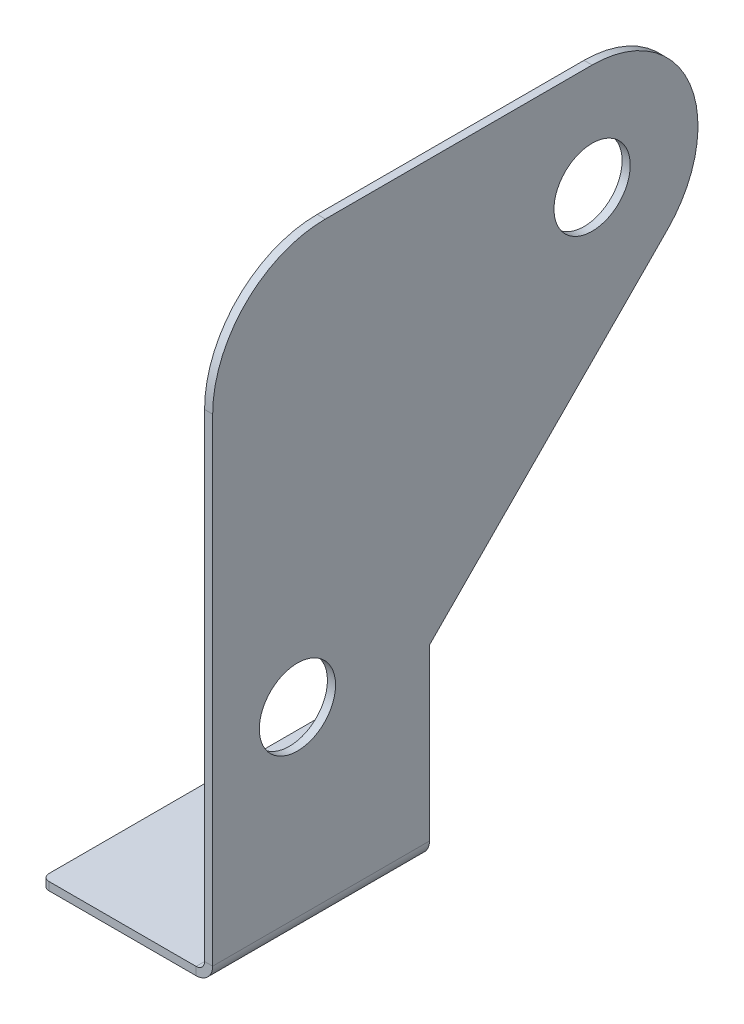
ISO-10303-21;
HEADER;
FILE_DESCRIPTION(('STEP AP214'),'2;1');
FILE_NAME('part.step','',(''),(''),'','','');
FILE_SCHEMA(('AUTOMOTIVE_DESIGN { 1 0 10303 214 1 1 1 1 }'));
ENDSEC;
DATA;
#1=APPLICATION_CONTEXT('core data for automotive mechanical design processes');
#2=APPLICATION_PROTOCOL_DEFINITION('international standard','automotive_design',2000,#1);
#3=PRODUCT_CONTEXT('',#1,'mechanical');
#4=PRODUCT('Part','Part','',(#3));
#5=PRODUCT_RELATED_PRODUCT_CATEGORY('part','',(#4));
#6=PRODUCT_DEFINITION_FORMATION('','',#4);
#7=PRODUCT_DEFINITION_CONTEXT('part definition',#1,'design');
#8=PRODUCT_DEFINITION('design','',#6,#7);
#9=PRODUCT_DEFINITION_SHAPE('','',#8);
#10=(LENGTH_UNIT() NAMED_UNIT(*) SI_UNIT(.MILLI.,.METRE.));
#11=(NAMED_UNIT(*) PLANE_ANGLE_UNIT() SI_UNIT($,.RADIAN.));
#12=(NAMED_UNIT(*) SI_UNIT($,.STERADIAN.) SOLID_ANGLE_UNIT());
#13=UNCERTAINTY_MEASURE_WITH_UNIT(LENGTH_MEASURE(1.E-05),#10,'distance_accuracy_value','');
#14=(GEOMETRIC_REPRESENTATION_CONTEXT(3) GLOBAL_UNCERTAINTY_ASSIGNED_CONTEXT((#13)) GLOBAL_UNIT_ASSIGNED_CONTEXT((#10,
#11,#12)) REPRESENTATION_CONTEXT('',''));
#15=CARTESIAN_POINT('',(0.,0.,0.));
#16=DIRECTION('',(0.,0.,1.));
#17=DIRECTION('',(1.,0.,0.));
#18=AXIS2_PLACEMENT_3D('',#15,#16,#17);
#19=CARTESIAN_POINT('',(3.175,0.,81.28));
#20=DIRECTION('',(0.,0.,1.));
#21=DIRECTION('',(-1.,0.,0.));
#22=AXIS2_PLACEMENT_3D('',#19,#20,#21);
#23=PLANE('',#22);
#24=DIRECTION('',(0.,-1.,0.));
#25=VECTOR('',#24,1.);
#26=CARTESIAN_POINT('',(-3.03784,0.,81.28));
#27=LINE('',#26,#25);
#28=CARTESIAN_POINT('',(-3.03784,3.03783999999999,81.28));
#29=VERTEX_POINT('',#28);
#30=CARTESIAN_POINT('',(-3.03784,0.,81.28));
#31=VERTEX_POINT('',#30);
#32=EDGE_CURVE('E11',#29,#31,#27,.T.);
#33=ORIENTED_EDGE('',*,*,#32,.F.);
#34=DIRECTION('',(1.,0.,0.));
#35=VECTOR('',#34,1.);
#36=CARTESIAN_POINT('',(3.175,3.03783999999999,81.28));
#37=LINE('',#36,#35);
#38=CARTESIAN_POINT('',(-58.2295,3.03783999999999,81.28));
#39=VERTEX_POINT('',#38);
#40=EDGE_CURVE('E104',#29,#39,#37,.F.);
#41=ORIENTED_EDGE('',*,*,#40,.T.);
#42=DIRECTION('',(0.,-1.,0.));
#43=VECTOR('',#42,1.);
#44=CARTESIAN_POINT('',(-58.2295,0.,81.28));
#45=LINE('',#44,#43);
#46=CARTESIAN_POINT('',(-58.2295,0.,81.28));
#47=VERTEX_POINT('',#46);
#48=EDGE_CURVE('E87',#39,#47,#45,.T.);
#49=ORIENTED_EDGE('',*,*,#48,.T.);
#50=DIRECTION('',(-1.,0.,0.));
#51=VECTOR('',#50,1.);
#52=CARTESIAN_POINT('',(3.175,0.,81.28));
#53=LINE('',#52,#51);
#54=EDGE_CURVE('E237',#31,#47,#53,.T.);
#55=ORIENTED_EDGE('',*,*,#54,.F.);
#56=EDGE_LOOP('',(#33,#41,#49,#55));
#57=FACE_BOUND('',#56,.T.);
#58=ADVANCED_FACE('F45',(#57),#23,.T.);
#59=CARTESIAN_POINT('',(-58.2295,0.,78.74));
#60=DIRECTION('',(0.,-1.,0.));
#61=DIRECTION('',(0.,0.,-1.));
#62=AXIS2_PLACEMENT_3D('',#59,#60,#61);
#63=CYLINDRICAL_SURFACE('',#62,2.54);
#64=ORIENTED_EDGE('',*,*,#48,.F.);
#65=CARTESIAN_POINT('',(-58.2295,3.03783999999999,78.74));
#66=DIRECTION('',(0.,-1.,0.));
#67=DIRECTION('',(0.,0.,-1.));
#68=AXIS2_PLACEMENT_3D('',#65,#66,#67);
#69=CIRCLE('',#68,2.54);
#70=CARTESIAN_POINT('',(-60.7695,3.03783999999999,78.74));
#71=VERTEX_POINT('',#70);
#72=EDGE_CURVE('E90',#39,#71,#69,.T.);
#73=ORIENTED_EDGE('',*,*,#72,.T.);
#74=DIRECTION('',(0.,-1.,0.));
#75=VECTOR('',#74,1.);
#76=CARTESIAN_POINT('',(-60.7695,0.,78.74));
#77=LINE('',#76,#75);
#78=CARTESIAN_POINT('',(-60.7695,0.,78.74));
#79=VERTEX_POINT('',#78);
#80=EDGE_CURVE('E61',#71,#79,#77,.T.);
#81=ORIENTED_EDGE('',*,*,#80,.T.);
#82=CARTESIAN_POINT('',(-58.2295,0.,78.74));
#83=DIRECTION('',(0.,-1.,0.));
#84=DIRECTION('',(0.,0.,-1.));
#85=AXIS2_PLACEMENT_3D('',#82,#83,#84);
#86=CIRCLE('',#85,2.54);
#87=EDGE_CURVE('E91',#47,#79,#86,.T.);
#88=ORIENTED_EDGE('',*,*,#87,.F.);
#89=EDGE_LOOP('',(#64,#73,#81,#88));
#90=FACE_BOUND('',#89,.T.);
#91=ADVANCED_FACE('F89',(#90),#63,.T.);
#92=CARTESIAN_POINT('',(-60.7695,0.,0.));
#93=DIRECTION('',(1.,0.,0.));
#94=DIRECTION('',(0.,0.,1.));
#95=AXIS2_PLACEMENT_3D('',#92,#93,#94);
#96=PLANE('',#95);
#97=ORIENTED_EDGE('',*,*,#80,.F.);
#98=DIRECTION('',(0.,0.,-1.));
#99=VECTOR('',#98,1.);
#100=CARTESIAN_POINT('',(-60.7695,3.03784,0.));
#101=LINE('',#100,#99);
#102=CARTESIAN_POINT('',(-60.7695,3.03784000000001,-47.0173975515729));
#103=VERTEX_POINT('',#102);
#104=EDGE_CURVE('E107',#103,#71,#101,.F.);
#105=ORIENTED_EDGE('',*,*,#104,.F.);
#106=DIRECTION('',(0.,-1.,0.));
#107=VECTOR('',#106,1.);
#108=CARTESIAN_POINT('',(-60.7695,0.,-47.0173975515729));
#109=LINE('',#108,#107);
#110=CARTESIAN_POINT('',(-60.7695,0.,-47.0173975515729));
#111=VERTEX_POINT('',#110);
#112=EDGE_CURVE('E122',#103,#111,#109,.T.);
#113=ORIENTED_EDGE('',*,*,#112,.T.);
#114=DIRECTION('',(0.,0.,1.));
#115=VECTOR('',#114,1.);
#116=CARTESIAN_POINT('',(-60.7695,0.,0.));
#117=LINE('',#116,#115);
#118=EDGE_CURVE('E108',#111,#79,#117,.T.);
#119=ORIENTED_EDGE('',*,*,#118,.T.);
#120=EDGE_LOOP('',(#97,#105,#113,#119));
#121=FACE_BOUND('',#120,.T.);
#122=ADVANCED_FACE('F248',(#121),#96,.F.);
#123=CARTESIAN_POINT('',(-58.2295,0.,-47.0173975515729));
#124=DIRECTION('',(0.,-1.,0.));
#125=DIRECTION('',(0.,0.,-1.));
#126=AXIS2_PLACEMENT_3D('',#123,#124,#125);
#127=CYLINDRICAL_SURFACE('',#126,2.54);
#128=ORIENTED_EDGE('',*,*,#112,.F.);
#129=CARTESIAN_POINT('',(-58.2295,3.03784,-47.0173975515729));
#130=DIRECTION('',(0.,-1.,0.));
#131=DIRECTION('',(0.,0.,-1.));
#132=AXIS2_PLACEMENT_3D('',#129,#130,#131);
#133=CIRCLE('',#132,2.54);
#134=CARTESIAN_POINT('',(-56.4334487757862,3.03784000000001,-48.8134487757867));
#135=VERTEX_POINT('',#134);
#136=EDGE_CURVE('E242',#103,#135,#133,.T.);
#137=ORIENTED_EDGE('',*,*,#136,.T.);
#138=DIRECTION('',(0.,-1.,0.));
#139=VECTOR('',#138,1.);
#140=CARTESIAN_POINT('',(-56.4334487757862,0.,-48.8134487757867));
#141=LINE('',#140,#139);
#142=CARTESIAN_POINT('',(-56.4334487757862,0.,-48.8134487757867));
#143=VERTEX_POINT('',#142);
#144=EDGE_CURVE('E119',#135,#143,#141,.T.);
#145=ORIENTED_EDGE('',*,*,#144,.T.);
#146=CARTESIAN_POINT('',(-58.2295,0.,-47.0173975515729));
#147=DIRECTION('',(0.,-1.,0.));
#148=DIRECTION('',(0.,0.,-1.));
#149=AXIS2_PLACEMENT_3D('',#146,#147,#148);
#150=CIRCLE('',#149,2.54);
#151=EDGE_CURVE('E228',#111,#143,#150,.T.);
#152=ORIENTED_EDGE('',*,*,#151,.F.);
#153=EDGE_LOOP('',(#128,#137,#145,#152));
#154=FACE_BOUND('',#153,.T.);
#155=ADVANCED_FACE('F245',(#154),#127,.T.);
#156=CARTESIAN_POINT('',(-60.7695,0.,-53.1495000000006));
#157=DIRECTION('',(-0.707106781186551,0.,0.707106781186544));
#158=DIRECTION('',(-0.707106781186544,0.,-0.707106781186551));
#159=AXIS2_PLACEMENT_3D('',#156,#157,#158);
#160=PLANE('',#159);
#161=ORIENTED_EDGE('',*,*,#144,.F.);
#162=DIRECTION('',(-0.707106781186544,0.,-0.707106781186551));
#163=VECTOR('',#162,1.);
#164=CARTESIAN_POINT('',(-60.7695,3.03784,-53.1495000000006));
#165=LINE('',#164,#163);
#166=CARTESIAN_POINT('',(-7.62,3.03784,0.));
#167=VERTEX_POINT('',#166);
#168=EDGE_CURVE('E112',#167,#135,#165,.T.);
#169=ORIENTED_EDGE('',*,*,#168,.F.);
#170=DIRECTION('',(0.,-1.,0.));
#171=VECTOR('',#170,1.);
#172=CARTESIAN_POINT('',(-7.62,0.,0.));
#173=LINE('',#172,#171);
#174=CARTESIAN_POINT('',(-7.62,0.,0.));
#175=VERTEX_POINT('',#174);
#176=EDGE_CURVE('E116',#167,#175,#173,.T.);
#177=ORIENTED_EDGE('',*,*,#176,.T.);
#178=DIRECTION('',(-0.707106781186544,0.,-0.707106781186551));
#179=VECTOR('',#178,1.);
#180=CARTESIAN_POINT('',(-60.7695,0.,-53.1495000000006));
#181=LINE('',#180,#179);
#182=EDGE_CURVE('E231',#175,#143,#181,.T.);
#183=ORIENTED_EDGE('',*,*,#182,.T.);
#184=EDGE_LOOP('',(#161,#169,#177,#183));
#185=FACE_BOUND('',#184,.T.);
#186=ADVANCED_FACE('F268',(#185),#160,.F.);
#187=CARTESIAN_POINT('',(3.175,0.,0.));
#188=DIRECTION('',(0.,0.,1.));
#189=DIRECTION('',(-1.,0.,0.));
#190=AXIS2_PLACEMENT_3D('',#187,#188,#189);
#191=PLANE('',#190);
#192=ORIENTED_EDGE('',*,*,#176,.F.);
#193=DIRECTION('',(1.,0.,0.));
#194=VECTOR('',#193,1.);
#195=CARTESIAN_POINT('',(3.175,3.03784,0.));
#196=LINE('',#195,#194);
#197=CARTESIAN_POINT('',(-3.03784,3.03784,0.));
#198=VERTEX_POINT('',#197);
#199=EDGE_CURVE('E110',#198,#167,#196,.F.);
#200=ORIENTED_EDGE('',*,*,#199,.F.);
#201=DIRECTION('',(0.,-1.,0.));
#202=VECTOR('',#201,1.);
#203=CARTESIAN_POINT('',(-3.03784,0.,0.));
#204=LINE('',#203,#202);
#205=CARTESIAN_POINT('',(-3.03784,0.,0.));
#206=VERTEX_POINT('',#205);
#207=EDGE_CURVE('E127',#198,#206,#204,.T.);
#208=ORIENTED_EDGE('',*,*,#207,.T.);
#209=DIRECTION('',(-1.,0.,0.));
#210=VECTOR('',#209,1.);
#211=CARTESIAN_POINT('',(3.175,0.,0.));
#212=LINE('',#211,#210);
#213=EDGE_CURVE('E234',#206,#175,#212,.T.);
#214=ORIENTED_EDGE('',*,*,#213,.T.);
#215=EDGE_LOOP('',(#192,#200,#208,#214));
#216=FACE_BOUND('',#215,.T.);
#217=ADVANCED_FACE('F271',(#216),#191,.F.);
#218=CARTESIAN_POINT('',(3.175,0.,0.));
#219=DIRECTION('',(0.,-1.,0.));
#220=DIRECTION('',(0.,0.,-1.));
#221=AXIS2_PLACEMENT_3D('',#218,#219,#220);
#222=PLANE('',#221);
#223=ORIENTED_EDGE('',*,*,#213,.F.);
#224=DIRECTION('',(0.,0.,1.));
#225=VECTOR('',#224,1.);
#226=CARTESIAN_POINT('',(-3.03784,0.,0.));
#227=LINE('',#226,#225);
#228=EDGE_CURVE('E96',#206,#31,#227,.T.);
#229=ORIENTED_EDGE('',*,*,#228,.T.);
#230=ORIENTED_EDGE('',*,*,#54,.T.);
#231=ORIENTED_EDGE('',*,*,#87,.T.);
#232=ORIENTED_EDGE('',*,*,#118,.F.);
#233=ORIENTED_EDGE('',*,*,#151,.T.);
#234=ORIENTED_EDGE('',*,*,#182,.F.);
#235=EDGE_LOOP('',(#223,#229,#230,#231,#232,#233,#234));
#236=FACE_BOUND('',#235,.T.);
#237=ADVANCED_FACE('F252',(#236),#222,.T.);
#238=CARTESIAN_POINT('',(3.175,3.03784,0.));
#239=DIRECTION('',(0.,-1.,0.));
#240=DIRECTION('',(0.,0.,-1.));
#241=AXIS2_PLACEMENT_3D('',#238,#239,#240);
#242=PLANE('',#241);
#243=ORIENTED_EDGE('',*,*,#199,.T.);
#244=ORIENTED_EDGE('',*,*,#168,.T.);
#245=ORIENTED_EDGE('',*,*,#136,.F.);
#246=ORIENTED_EDGE('',*,*,#104,.T.);
#247=ORIENTED_EDGE('',*,*,#72,.F.);
#248=ORIENTED_EDGE('',*,*,#40,.F.);
#249=DIRECTION('',(0.,0.,1.));
#250=VECTOR('',#249,1.);
#251=CARTESIAN_POINT('',(-3.03784,3.03784,0.));
#252=LINE('',#251,#250);
#253=EDGE_CURVE('E53',#198,#29,#252,.T.);
#254=ORIENTED_EDGE('',*,*,#253,.F.);
#255=EDGE_LOOP('',(#243,#244,#245,#246,#247,#248,#254));
#256=FACE_BOUND('',#255,.T.);
#257=ADVANCED_FACE('F101',(#256),#242,.F.);
#258=CARTESIAN_POINT('',(3.175,185.42508,39.0525));
#259=DIRECTION('',(1.,0.,0.));
#260=DIRECTION('',(0.,0.,-1.));
#261=AXIS2_PLACEMENT_3D('',#258,#259,#260);
#262=CYLINDRICAL_SURFACE('',#261,42.2275);
#263=DIRECTION('',(1.,0.,0.));
#264=VECTOR('',#263,1.);
#265=CARTESIAN_POINT('',(3.175,227.65258,39.0525));
#266=LINE('',#265,#264);
#267=CARTESIAN_POINT('',(0.13716,227.65258,39.0525));
#268=VERTEX_POINT('',#267);
#269=CARTESIAN_POINT('',(3.175,227.65258,39.0525));
#270=VERTEX_POINT('',#269);
#271=EDGE_CURVE('E212',#268,#270,#266,.T.);
#272=ORIENTED_EDGE('',*,*,#271,.F.);
#273=CARTESIAN_POINT('',(0.13716,185.42508,39.0525));
#274=DIRECTION('',(1.,0.,0.));
#275=DIRECTION('',(0.,0.,-1.));
#276=AXIS2_PLACEMENT_3D('',#273,#274,#275);
#277=CIRCLE('',#276,42.2275);
#278=CARTESIAN_POINT('',(0.13716,185.42508,81.28));
#279=VERTEX_POINT('',#278);
#280=EDGE_CURVE('E218',#268,#279,#277,.T.);
#281=ORIENTED_EDGE('',*,*,#280,.T.);
#282=DIRECTION('',(1.,0.,0.));
#283=VECTOR('',#282,1.);
#284=CARTESIAN_POINT('',(3.175,185.42508,81.28));
#285=LINE('',#284,#283);
#286=CARTESIAN_POINT('',(3.175,185.42508,81.28));
#287=VERTEX_POINT('',#286);
#288=EDGE_CURVE('E215',#279,#287,#285,.T.);
#289=ORIENTED_EDGE('',*,*,#288,.T.);
#290=CARTESIAN_POINT('',(3.175,185.42508,39.0525));
#291=DIRECTION('',(1.,0.,0.));
#292=DIRECTION('',(0.,0.,-1.));
#293=AXIS2_PLACEMENT_3D('',#290,#291,#292);
#294=CIRCLE('',#293,42.2275);
#295=EDGE_CURVE('E179',#270,#287,#294,.T.);
#296=ORIENTED_EDGE('',*,*,#295,.F.);
#297=EDGE_LOOP('',(#272,#281,#289,#296));
#298=FACE_BOUND('',#297,.T.);
#299=ADVANCED_FACE('F343',(#298),#262,.T.);
#300=CARTESIAN_POINT('',(3.175,227.65258,0.));
#301=DIRECTION('',(0.,-1.,0.));
#302=DIRECTION('',(0.,0.,-1.));
#303=AXIS2_PLACEMENT_3D('',#300,#301,#302);
#304=PLANE('',#303);
#305=DIRECTION('',(1.,0.,0.));
#306=VECTOR('',#305,1.);
#307=CARTESIAN_POINT('',(3.175,227.65258,-60.96));
#308=LINE('',#307,#306);
#309=CARTESIAN_POINT('',(0.13716,227.65258,-60.96));
#310=VERTEX_POINT('',#309);
#311=CARTESIAN_POINT('',(3.175,227.65258,-60.96));
#312=VERTEX_POINT('',#311);
#313=EDGE_CURVE('E203',#310,#312,#308,.T.);
#314=ORIENTED_EDGE('',*,*,#313,.F.);
#315=DIRECTION('',(0.,0.,-1.));
#316=VECTOR('',#315,1.);
#317=CARTESIAN_POINT('',(0.13716,227.65258,0.));
#318=LINE('',#317,#316);
#319=EDGE_CURVE('E161',#268,#310,#318,.T.);
#320=ORIENTED_EDGE('',*,*,#319,.F.);
#321=ORIENTED_EDGE('',*,*,#271,.T.);
#322=DIRECTION('',(0.,0.,-1.));
#323=VECTOR('',#322,1.);
#324=CARTESIAN_POINT('',(3.175,227.65258,0.));
#325=LINE('',#324,#323);
#326=EDGE_CURVE('E209',#270,#312,#325,.T.);
#327=ORIENTED_EDGE('',*,*,#326,.T.);
#328=EDGE_LOOP('',(#314,#320,#321,#327));
#329=FACE_BOUND('',#328,.T.);
#330=ADVANCED_FACE('F373',(#329),#304,.F.);
#331=CARTESIAN_POINT('',(3.175,187.96508,-60.96));
#332=DIRECTION('',(1.,0.,0.));
#333=DIRECTION('',(0.,0.,-1.));
#334=AXIS2_PLACEMENT_3D('',#331,#332,#333);
#335=CYLINDRICAL_SURFACE('',#334,39.6875);
#336=DIRECTION('',(1.,0.,0.));
#337=VECTOR('',#336,1.);
#338=CARTESIAN_POINT('',(3.175,160.063269698735,-89.1838664637258));
#339=LINE('',#338,#337);
#340=CARTESIAN_POINT('',(0.13716,160.063269698735,-89.1838664637258));
#341=VERTEX_POINT('',#340);
#342=CARTESIAN_POINT('',(3.175,160.063269698735,-89.1838664637258));
#343=VERTEX_POINT('',#342);
#344=EDGE_CURVE('E197',#341,#343,#339,.T.);
#345=ORIENTED_EDGE('',*,*,#344,.F.);
#346=CARTESIAN_POINT('',(0.13716,187.96508,-60.96));
#347=DIRECTION('',(1.,0.,0.));
#348=DIRECTION('',(0.,0.,-1.));
#349=AXIS2_PLACEMENT_3D('',#346,#347,#348);
#350=CIRCLE('',#349,39.6875);
#351=EDGE_CURVE('E206',#341,#310,#350,.T.);
#352=ORIENTED_EDGE('',*,*,#351,.T.);
#353=ORIENTED_EDGE('',*,*,#313,.T.);
#354=CARTESIAN_POINT('',(3.175,187.96508,-60.96));
#355=DIRECTION('',(1.,0.,0.));
#356=DIRECTION('',(0.,0.,-1.));
#357=AXIS2_PLACEMENT_3D('',#354,#355,#356);
#358=CIRCLE('',#357,39.6875);
#359=EDGE_CURVE('E182',#343,#312,#358,.T.);
#360=ORIENTED_EDGE('',*,*,#359,.F.);
#361=EDGE_LOOP('',(#345,#352,#353,#360));
#362=FACE_BOUND('',#361,.T.);
#363=ADVANCED_FACE('F369',(#362),#335,.T.);
#364=CARTESIAN_POINT('',(3.175,34.5242051485853,34.922700188947));
#365=DIRECTION('',(0.,-0.703037739874391,-0.711152540818289));
#366=DIRECTION('',(0.,0.711152540818289,-0.703037739874391));
#367=AXIS2_PLACEMENT_3D('',#364,#365,#366);
#368=PLANE('',#367);
#369=DIRECTION('',(1.,0.,0.));
#370=VECTOR('',#369,1.);
#371=CARTESIAN_POINT('',(3.175,69.85,0.));
#372=LINE('',#371,#370);
#373=CARTESIAN_POINT('',(0.13716,69.85,0.));
#374=VERTEX_POINT('',#373);
#375=CARTESIAN_POINT('',(3.175,69.85,0.));
#376=VERTEX_POINT('',#375);
#377=EDGE_CURVE('E176',#374,#376,#372,.T.);
#378=ORIENTED_EDGE('',*,*,#377,.F.);
#379=DIRECTION('',(0.,0.711152540818289,-0.703037739874391));
#380=VECTOR('',#379,1.);
#381=CARTESIAN_POINT('',(0.13716,34.5242051485853,34.922700188947));
#382=LINE('',#381,#380);
#383=EDGE_CURVE('E200',#374,#341,#382,.T.);
#384=ORIENTED_EDGE('',*,*,#383,.T.);
#385=ORIENTED_EDGE('',*,*,#344,.T.);
#386=DIRECTION('',(0.,0.711152540818289,-0.703037739874391));
#387=VECTOR('',#386,1.);
#388=CARTESIAN_POINT('',(3.175,34.5242051485853,34.922700188947));
#389=LINE('',#388,#387);
#390=EDGE_CURVE('E185',#376,#343,#389,.T.);
#391=ORIENTED_EDGE('',*,*,#390,.F.);
#392=EDGE_LOOP('',(#378,#384,#385,#391));
#393=FACE_BOUND('',#392,.T.);
#394=ADVANCED_FACE('F365',(#393),#368,.T.);
#395=CARTESIAN_POINT('',(3.175,187.96508,-60.96));
#396=DIRECTION('',(1.,0.,0.));
#397=DIRECTION('',(0.,0.,-1.));
#398=AXIS2_PLACEMENT_3D('',#395,#396,#397);
#399=CYLINDRICAL_SURFACE('',#398,14.2875);
#400=CARTESIAN_POINT('',(3.175,187.96508,-60.96));
#401=DIRECTION('',(1.,0.,0.));
#402=DIRECTION('',(0.,0.,-1.));
#403=AXIS2_PLACEMENT_3D('',#400,#401,#402);
#404=CIRCLE('',#403,14.2875);
#405=CARTESIAN_POINT('',(3.175,187.96508,-75.2475));
#406=VERTEX_POINT('',#405);
#407=EDGE_CURVE('E194',#406,#406,#404,.T.);
#408=ORIENTED_EDGE('',*,*,#407,.T.);
#409=EDGE_LOOP('',(#408));
#410=FACE_BOUND('',#409,.T.);
#411=CARTESIAN_POINT('',(0.13716,187.96508,-60.96));
#412=DIRECTION('',(1.,0.,0.));
#413=DIRECTION('',(0.,0.,-1.));
#414=AXIS2_PLACEMENT_3D('',#411,#412,#413);
#415=CIRCLE('',#414,14.2875);
#416=CARTESIAN_POINT('',(0.13716,187.96508,-75.2475));
#417=VERTEX_POINT('',#416);
#418=EDGE_CURVE('E167',#417,#417,#415,.T.);
#419=ORIENTED_EDGE('',*,*,#418,.F.);
#420=EDGE_LOOP('',(#419));
#421=FACE_BOUND('',#420,.T.);
#422=ADVANCED_FACE('F361',(#410,#421),#399,.F.);
#423=CARTESIAN_POINT('',(3.175,74.4622886801529,49.5046));
#424=DIRECTION('',(1.,0.,0.));
#425=DIRECTION('',(0.,0.,-1.));
#426=AXIS2_PLACEMENT_3D('',#423,#424,#425);
#427=CYLINDRICAL_SURFACE('',#426,14.2875);
#428=CARTESIAN_POINT('',(3.175,74.4622886801529,49.5046));
#429=DIRECTION('',(1.,0.,0.));
#430=DIRECTION('',(0.,0.,-1.));
#431=AXIS2_PLACEMENT_3D('',#428,#429,#430);
#432=CIRCLE('',#431,14.2875);
#433=CARTESIAN_POINT('',(3.175,74.4622886801529,35.2171));
#434=VERTEX_POINT('',#433);
#435=EDGE_CURVE('E191',#434,#434,#432,.T.);
#436=ORIENTED_EDGE('',*,*,#435,.T.);
#437=EDGE_LOOP('',(#436));
#438=FACE_BOUND('',#437,.T.);
#439=CARTESIAN_POINT('',(0.137159999999997,74.4622886801529,49.5046));
#440=DIRECTION('',(1.,0.,0.));
#441=DIRECTION('',(0.,0.,-1.));
#442=AXIS2_PLACEMENT_3D('',#439,#440,#441);
#443=CIRCLE('',#442,14.2875);
#444=CARTESIAN_POINT('',(0.137159999999997,74.4622886801529,35.2171));
#445=VERTEX_POINT('',#444);
#446=EDGE_CURVE('E170',#445,#445,#443,.T.);
#447=ORIENTED_EDGE('',*,*,#446,.F.);
#448=EDGE_LOOP('',(#447));
#449=FACE_BOUND('',#448,.T.);
#450=ADVANCED_FACE('F357',(#438,#449),#427,.F.);
#451=CARTESIAN_POINT('',(3.175,0.,0.));
#452=DIRECTION('',(1.,0.,0.));
#453=DIRECTION('',(0.,0.,-1.));
#454=AXIS2_PLACEMENT_3D('',#451,#452,#453);
#455=PLANE('',#454);
#456=ORIENTED_EDGE('',*,*,#435,.F.);
#457=EDGE_LOOP('',(#456));
#458=FACE_BOUND('',#457,.T.);
#459=ORIENTED_EDGE('',*,*,#407,.F.);
#460=EDGE_LOOP('',(#459));
#461=FACE_BOUND('',#460,.T.);
#462=DIRECTION('',(0.,1.,0.));
#463=VECTOR('',#462,1.);
#464=CARTESIAN_POINT('',(3.175,0.,81.28));
#465=LINE('',#464,#463);
#466=CARTESIAN_POINT('',(3.175,6.21283999999999,81.28));
#467=VERTEX_POINT('',#466);
#468=EDGE_CURVE('E154',#467,#287,#465,.T.);
#469=ORIENTED_EDGE('',*,*,#468,.F.);
#470=DIRECTION('',(0.,0.,-1.));
#471=VECTOR('',#470,1.);
#472=CARTESIAN_POINT('',(3.175,6.21284,0.));
#473=LINE('',#472,#471);
#474=CARTESIAN_POINT('',(3.175,6.21284,0.));
#475=VERTEX_POINT('',#474);
#476=EDGE_CURVE('E188',#467,#475,#473,.T.);
#477=ORIENTED_EDGE('',*,*,#476,.T.);
#478=DIRECTION('',(0.,-1.,0.));
#479=VECTOR('',#478,1.);
#480=CARTESIAN_POINT('',(3.175,0.,0.));
#481=LINE('',#480,#479);
#482=EDGE_CURVE('E173',#376,#475,#481,.T.);
#483=ORIENTED_EDGE('',*,*,#482,.F.);
#484=ORIENTED_EDGE('',*,*,#390,.T.);
#485=ORIENTED_EDGE('',*,*,#359,.T.);
#486=ORIENTED_EDGE('',*,*,#326,.F.);
#487=ORIENTED_EDGE('',*,*,#295,.T.);
#488=EDGE_LOOP('',(#469,#477,#483,#484,#485,#486,#487));
#489=FACE_BOUND('',#488,.T.);
#490=ADVANCED_FACE('F315',(#458,#461,#489),#455,.T.);
#491=CARTESIAN_POINT('',(3.175,0.,0.));
#492=DIRECTION('',(0.,0.,1.));
#493=DIRECTION('',(0.,-1.,0.));
#494=AXIS2_PLACEMENT_3D('',#491,#492,#493);
#495=PLANE('',#494);
#496=DIRECTION('',(1.,0.,0.));
#497=VECTOR('',#496,1.);
#498=CARTESIAN_POINT('',(3.175,6.21284,0.));
#499=LINE('',#498,#497);
#500=CARTESIAN_POINT('',(0.13716,6.21284,0.));
#501=VERTEX_POINT('',#500);
#502=EDGE_CURVE('E221',#501,#475,#499,.T.);
#503=ORIENTED_EDGE('',*,*,#502,.F.);
#504=DIRECTION('',(0.,1.,0.));
#505=VECTOR('',#504,1.);
#506=CARTESIAN_POINT('',(0.13716,0.,0.));
#507=LINE('',#506,#505);
#508=EDGE_CURVE('E158',#374,#501,#507,.F.);
#509=ORIENTED_EDGE('',*,*,#508,.F.);
#510=ORIENTED_EDGE('',*,*,#377,.T.);
#511=ORIENTED_EDGE('',*,*,#482,.T.);
#512=EDGE_LOOP('',(#503,#509,#510,#511));
#513=FACE_BOUND('',#512,.T.);
#514=ADVANCED_FACE('F312',(#513),#495,.F.);
#515=CARTESIAN_POINT('',(0.13716,0.,0.));
#516=DIRECTION('',(1.,0.,0.));
#517=DIRECTION('',(0.,0.,-1.));
#518=AXIS2_PLACEMENT_3D('',#515,#516,#517);
#519=PLANE('',#518);
#520=ORIENTED_EDGE('',*,*,#446,.T.);
#521=EDGE_LOOP('',(#520));
#522=FACE_BOUND('',#521,.T.);
#523=ORIENTED_EDGE('',*,*,#418,.T.);
#524=EDGE_LOOP('',(#523));
#525=FACE_BOUND('',#524,.T.);
#526=DIRECTION('',(0.,1.,0.));
#527=VECTOR('',#526,1.);
#528=CARTESIAN_POINT('',(0.13716,0.,81.28));
#529=LINE('',#528,#527);
#530=CARTESIAN_POINT('',(0.13716,6.21283999999999,81.28));
#531=VERTEX_POINT('',#530);
#532=EDGE_CURVE('E164',#531,#279,#529,.T.);
#533=ORIENTED_EDGE('',*,*,#532,.T.);
#534=ORIENTED_EDGE('',*,*,#280,.F.);
#535=ORIENTED_EDGE('',*,*,#319,.T.);
#536=ORIENTED_EDGE('',*,*,#351,.F.);
#537=ORIENTED_EDGE('',*,*,#383,.F.);
#538=ORIENTED_EDGE('',*,*,#508,.T.);
#539=DIRECTION('',(0.,0.,-1.));
#540=VECTOR('',#539,1.);
#541=CARTESIAN_POINT('',(0.13716,6.21283999999999,0.));
#542=LINE('',#541,#540);
#543=EDGE_CURVE('E224',#531,#501,#542,.T.);
#544=ORIENTED_EDGE('',*,*,#543,.F.);
#545=EDGE_LOOP('',(#533,#534,#535,#536,#537,#538,#544));
#546=FACE_BOUND('',#545,.T.);
#547=ADVANCED_FACE('F349',(#522,#525,#546),#519,.F.);
#548=CARTESIAN_POINT('',(3.175,0.,81.28));
#549=DIRECTION('',(0.,0.,-1.));
#550=DIRECTION('',(0.,1.,0.));
#551=AXIS2_PLACEMENT_3D('',#548,#549,#550);
#552=PLANE('',#551);
#553=ORIENTED_EDGE('',*,*,#288,.F.);
#554=ORIENTED_EDGE('',*,*,#532,.F.);
#555=DIRECTION('',(1.,0.,0.));
#556=VECTOR('',#555,1.);
#557=CARTESIAN_POINT('',(3.175,6.21283999999999,81.28));
#558=LINE('',#557,#556);
#559=EDGE_CURVE('E148',#531,#467,#558,.T.);
#560=ORIENTED_EDGE('',*,*,#559,.T.);
#561=ORIENTED_EDGE('',*,*,#468,.T.);
#562=EDGE_LOOP('',(#553,#554,#560,#561));
#563=FACE_BOUND('',#562,.T.);
#564=ADVANCED_FACE('F346',(#563),#552,.F.);
#565=CARTESIAN_POINT('',(-3.03784,6.21283999999999,81.28));
#566=DIRECTION('',(0.,0.,1.));
#567=DIRECTION('',(1.,0.,0.));
#568=AXIS2_PLACEMENT_3D('',#565,#566,#567);
#569=PLANE('',#568);
#570=ORIENTED_EDGE('',*,*,#559,.F.);
#571=CARTESIAN_POINT('',(-3.03784,6.21283999999999,81.28));
#572=DIRECTION('',(0.,0.,-1.));
#573=DIRECTION('',(0.,1.,0.));
#574=AXIS2_PLACEMENT_3D('',#571,#572,#573);
#575=CIRCLE('',#574,3.175);
#576=EDGE_CURVE('E137',#531,#29,#575,.T.);
#577=ORIENTED_EDGE('',*,*,#576,.T.);
#578=ORIENTED_EDGE('',*,*,#32,.T.);
#579=CARTESIAN_POINT('',(-3.03784,6.21283999999999,81.28));
#580=DIRECTION('',(0.,0.,-1.));
#581=DIRECTION('',(-1.,0.,0.));
#582=AXIS2_PLACEMENT_3D('',#579,#580,#581);
#583=CIRCLE('',#582,6.21284);
#584=EDGE_CURVE('E150',#467,#31,#583,.T.);
#585=ORIENTED_EDGE('',*,*,#584,.F.);
#586=EDGE_LOOP('',(#570,#577,#578,#585));
#587=FACE_BOUND('',#586,.T.);
#588=ADVANCED_FACE('F145',(#587),#569,.T.);
#589=CARTESIAN_POINT('',(-3.03784,6.21284,0.));
#590=DIRECTION('',(0.,0.,-1.));
#591=DIRECTION('',(0.,1.,0.));
#592=AXIS2_PLACEMENT_3D('',#589,#590,#591);
#593=PLANE('',#592);
#594=ORIENTED_EDGE('',*,*,#207,.F.);
#595=CARTESIAN_POINT('',(-3.03784,6.21284,0.));
#596=DIRECTION('',(0.,0.,-1.));
#597=DIRECTION('',(0.,1.,0.));
#598=AXIS2_PLACEMENT_3D('',#595,#596,#597);
#599=CIRCLE('',#598,3.175);
#600=EDGE_CURVE('E140',#198,#501,#599,.F.);
#601=ORIENTED_EDGE('',*,*,#600,.T.);
#602=ORIENTED_EDGE('',*,*,#502,.T.);
#603=CARTESIAN_POINT('',(-3.03784,6.21284,0.));
#604=DIRECTION('',(0.,0.,1.));
#605=DIRECTION('',(0.,-1.,0.));
#606=AXIS2_PLACEMENT_3D('',#603,#604,#605);
#607=CIRCLE('',#606,6.21284);
#608=EDGE_CURVE('E226',#206,#475,#607,.T.);
#609=ORIENTED_EDGE('',*,*,#608,.F.);
#610=EDGE_LOOP('',(#594,#601,#602,#609));
#611=FACE_BOUND('',#610,.T.);
#612=ADVANCED_FACE('F277',(#611),#593,.T.);
#613=CARTESIAN_POINT('',(-3.03784,6.21283999999998,122.310256743039));
#614=DIRECTION('',(0.,0.,-1.));
#615=DIRECTION('',(0.,1.,0.));
#616=AXIS2_PLACEMENT_3D('',#613,#614,#615);
#617=CYLINDRICAL_SURFACE('',#616,6.21284);
#618=ORIENTED_EDGE('',*,*,#608,.T.);
#619=ORIENTED_EDGE('',*,*,#476,.F.);
#620=ORIENTED_EDGE('',*,*,#584,.T.);
#621=ORIENTED_EDGE('',*,*,#228,.F.);
#622=EDGE_LOOP('',(#618,#619,#620,#621));
#623=FACE_BOUND('',#622,.T.);
#624=ADVANCED_FACE('F316',(#623),#617,.T.);
#625=CARTESIAN_POINT('',(-3.03784,6.21283999999998,122.310256743039));
#626=DIRECTION('',(0.,0.,-1.));
#627=DIRECTION('',(0.,1.,0.));
#628=AXIS2_PLACEMENT_3D('',#625,#626,#627);
#629=CYLINDRICAL_SURFACE('',#628,3.175);
#630=ORIENTED_EDGE('',*,*,#600,.F.);
#631=ORIENTED_EDGE('',*,*,#253,.T.);
#632=ORIENTED_EDGE('',*,*,#576,.F.);
#633=ORIENTED_EDGE('',*,*,#543,.T.);
#634=EDGE_LOOP('',(#630,#631,#632,#633));
#635=FACE_BOUND('',#634,.T.);
#636=ADVANCED_FACE('F134',(#635),#629,.F.);
#637=CLOSED_SHELL('',(#58,#91,#122,#155,#186,#217,#237,#257,#299,#330,#363,#394,#422,#450,#490,
#514,#547,#564,#588,#612,#624,#636));
#638=MANIFOLD_SOLID_BREP('B2',#637);
#639=ADVANCED_BREP_SHAPE_REPRESENTATION('',(#18,#638),#14);
#640=SHAPE_DEFINITION_REPRESENTATION(#9,#639);
ENDSEC;
END-ISO-10303-21;
